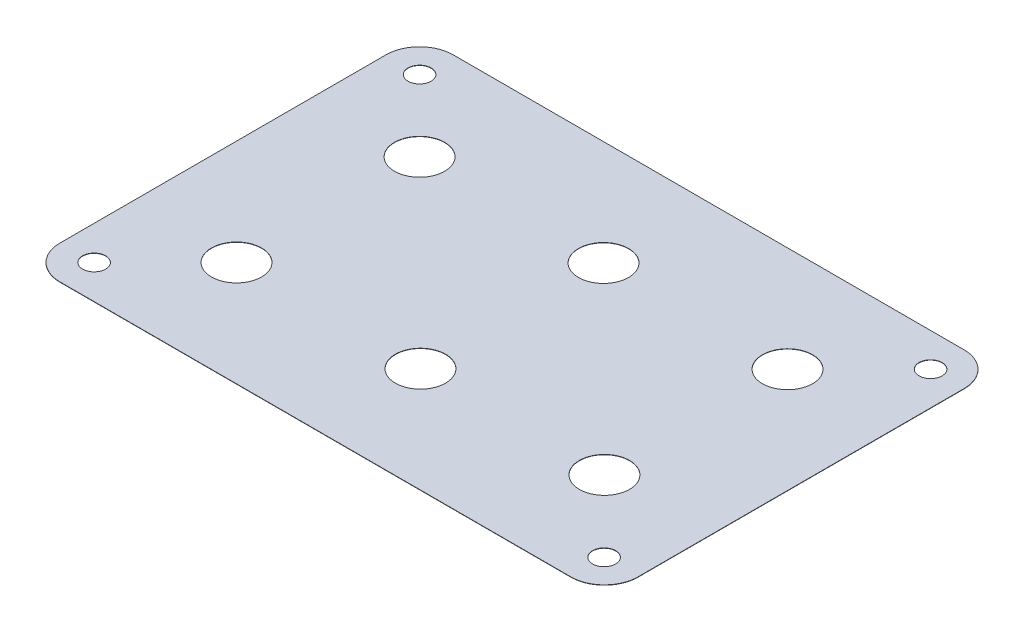
ISO-10303-21;
HEADER;
FILE_DESCRIPTION(('STEP AP214'),'2;1');
FILE_NAME('part.step','',(''),(''),'','','');
FILE_SCHEMA(('AUTOMOTIVE_DESIGN { 1 0 10303 214 1 1 1 1 }'));
ENDSEC;
DATA;
#1=APPLICATION_CONTEXT('core data for automotive mechanical design processes');
#2=APPLICATION_PROTOCOL_DEFINITION('international standard','automotive_design',2000,#1);
#3=PRODUCT_CONTEXT('',#1,'mechanical');
#4=PRODUCT('Part','Part','',(#3));
#5=PRODUCT_RELATED_PRODUCT_CATEGORY('part','',(#4));
#6=PRODUCT_DEFINITION_FORMATION('','',#4);
#7=PRODUCT_DEFINITION_CONTEXT('part definition',#1,'design');
#8=PRODUCT_DEFINITION('design','',#6,#7);
#9=PRODUCT_DEFINITION_SHAPE('','',#8);
#10=(LENGTH_UNIT() NAMED_UNIT(*) SI_UNIT(.MILLI.,.METRE.));
#11=(NAMED_UNIT(*) PLANE_ANGLE_UNIT() SI_UNIT($,.RADIAN.));
#12=(NAMED_UNIT(*) SI_UNIT($,.STERADIAN.) SOLID_ANGLE_UNIT());
#13=UNCERTAINTY_MEASURE_WITH_UNIT(LENGTH_MEASURE(1.E-05),#10,'distance_accuracy_value','');
#14=(GEOMETRIC_REPRESENTATION_CONTEXT(3) GLOBAL_UNCERTAINTY_ASSIGNED_CONTEXT((#13)) GLOBAL_UNIT_ASSIGNED_CONTEXT((#10,
#11,#12)) REPRESENTATION_CONTEXT('',''));
#15=CARTESIAN_POINT('',(0.,0.,0.));
#16=DIRECTION('',(0.,0.,1.));
#17=DIRECTION('',(1.,0.,0.));
#18=AXIS2_PLACEMENT_3D('',#15,#16,#17);
#19=CARTESIAN_POINT('',(7991.475,3.175,-9992.74082946777));
#20=DIRECTION('',(0.,1.,0.));
#21=DIRECTION('',(0.,0.,1.));
#22=AXIS2_PLACEMENT_3D('',#19,#20,#21);
#23=PLANE('',#22);
#24=CARTESIAN_POINT('',(7736.07818603515,3.175,-10244.5816589355));
#25=DIRECTION('',(0.,1.,0.));
#26=DIRECTION('',(0.,0.,1.));
#27=AXIS2_PLACEMENT_3D('',#24,#25,#26);
#28=CIRCLE('',#27,122.428186035156);
#29=CARTESIAN_POINT('',(7736.07818603515,3.175,-10122.1534729004));
#30=VERTEX_POINT('',#29);
#31=EDGE_CURVE('E241',#30,#30,#28,.T.);
#32=ORIENTED_EDGE('',*,*,#31,.F.);
#33=EDGE_LOOP('',(#32));
#34=FACE_BOUND('',#33,.T.);
#35=CARTESIAN_POINT('',(2316.98803100586,3.175,-13704.3159263611));
#36=DIRECTION('',(0.,1.,0.));
#37=DIRECTION('',(0.,0.,1.));
#38=AXIS2_PLACEMENT_3D('',#35,#36,#37);
#39=CIRCLE('',#38,122.427943801899);
#40=CARTESIAN_POINT('',(2316.98803100586,3.175,-13581.8879825592));
#41=VERTEX_POINT('',#40);
#42=EDGE_CURVE('E253',#41,#41,#39,.T.);
#43=ORIENTED_EDGE('',*,*,#42,.F.);
#44=EDGE_LOOP('',(#43));
#45=FACE_BOUND('',#44,.T.);
#46=CARTESIAN_POINT('',(5026.40598449707,3.175,-11004.2957519531));
#47=DIRECTION('',(0.,1.,0.));
#48=DIRECTION('',(0.,0.,1.));
#49=AXIS2_PLACEMENT_3D('',#46,#47,#48);
#50=CIRCLE('',#49,266.445945739755);
#51=CARTESIAN_POINT('',(5026.40598449707,3.175,-10737.8498062134));
#52=VERTEX_POINT('',#51);
#53=EDGE_CURVE('E265',#52,#52,#50,.T.);
#54=ORIENTED_EDGE('',*,*,#53,.F.);
#55=EDGE_LOOP('',(#54));
#56=FACE_BOUND('',#55,.T.);
#57=CARTESIAN_POINT('',(6980.17393798828,3.175,-12948.1577209473));
#58=DIRECTION('',(0.,1.,0.));
#59=DIRECTION('',(0.,0.,1.));
#60=AXIS2_PLACEMENT_3D('',#57,#58,#59);
#61=CIRCLE('',#60,266.445751953125);
#62=CARTESIAN_POINT('',(6980.17393798828,3.175,-12681.7119689941));
#63=VERTEX_POINT('',#62);
#64=EDGE_CURVE('E277',#63,#63,#61,.T.);
#65=ORIENTED_EDGE('',*,*,#64,.F.);
#66=EDGE_LOOP('',(#65));
#67=FACE_BOUND('',#66,.T.);
#68=CARTESIAN_POINT('',(3072.89208526611,3.175,-12948.1577209473));
#69=DIRECTION('',(0.,1.,0.));
#70=DIRECTION('',(0.,0.,1.));
#71=AXIS2_PLACEMENT_3D('',#68,#69,#70);
#72=CIRCLE('',#71,266.445848846435);
#73=CARTESIAN_POINT('',(3072.89208526611,3.175,-12681.7118721008));
#74=VERTEX_POINT('',#73);
#75=EDGE_CURVE('E289',#74,#74,#72,.T.);
#76=ORIENTED_EDGE('',*,*,#75,.F.);
#77=EDGE_LOOP('',(#76));
#78=FACE_BOUND('',#77,.T.);
#79=CARTESIAN_POINT('',(7739.12606201172,3.175,-9888.21968994141));
#80=CARTESIAN_POINT('',(7936.23031005859,3.175,-9888.21968994141));
#81=CARTESIAN_POINT('',(8095.99575195312,3.175,-10047.9859069824));
#82=CARTESIAN_POINT('',(8095.99575195312,3.175,-10245.0901550293));
#83=B_SPLINE_CURVE_WITH_KNOTS('',3,(#79,#80,#81,#82),.UNSPECIFIED.,.F.,.F.,(4,4),(7.,8.),.UNSPECIFIED.);
#84=CARTESIAN_POINT('',(7739.12606201172,3.175,-9888.21968994141));
#85=VERTEX_POINT('',#84);
#86=CARTESIAN_POINT('',(8095.99575195312,3.175,-10245.0901550293));
#87=VERTEX_POINT('',#86);
#88=EDGE_CURVE('E294',#85,#87,#83,.T.);
#89=ORIENTED_EDGE('',*,*,#88,.T.);
#90=DIRECTION('',(0.,0.,-1.));
#91=VECTOR('',#90,1.);
#92=CARTESIAN_POINT('',(8095.99575195312,3.175,-13707.3640930176));
#93=LINE('',#92,#91);
#94=CARTESIAN_POINT('',(8095.99575195312,3.175,-13707.3640930176));
#95=VERTEX_POINT('',#94);
#96=EDGE_CURVE('E94',#87,#95,#93,.T.);
#97=ORIENTED_EDGE('',*,*,#96,.T.);
#98=CARTESIAN_POINT('',(8095.99575195312,3.175,-13707.3640930176));
#99=CARTESIAN_POINT('',(8095.99575195312,3.175,-13904.4683410644));
#100=CARTESIAN_POINT('',(7936.23031005859,3.175,-14064.2341705322));
#101=CARTESIAN_POINT('',(7739.12606201172,3.175,-14064.2341705322));
#102=B_SPLINE_CURVE_WITH_KNOTS('',3,(#98,#99,#100,#101),.UNSPECIFIED.,.F.,.F.,(4,4),(5.,6.),.UNSPECIFIED.);
#103=CARTESIAN_POINT('',(7739.12606201172,3.175,-14064.2341705322));
#104=VERTEX_POINT('',#103);
#105=EDGE_CURVE('E160',#95,#104,#102,.T.);
#106=ORIENTED_EDGE('',*,*,#105,.T.);
#107=DIRECTION('',(-1.,0.,0.));
#108=VECTOR('',#107,1.);
#109=CARTESIAN_POINT('',(2313.68590698242,3.175,-14064.2341705322));
#110=LINE('',#109,#108);
#111=CARTESIAN_POINT('',(2313.68590698242,3.175,-14064.2341705322));
#112=VERTEX_POINT('',#111);
#113=EDGE_CURVE('E155',#104,#112,#110,.T.);
#114=ORIENTED_EDGE('',*,*,#113,.T.);
#115=CARTESIAN_POINT('',(2313.68590698242,3.175,-14064.2341705322));
#116=CARTESIAN_POINT('',(2116.58185272217,3.175,-14064.2341705322));
#117=CARTESIAN_POINT('',(1956.81582946777,3.175,-13904.4679534912));
#118=CARTESIAN_POINT('',(1956.81582946777,3.175,-13707.3640930176));
#119=B_SPLINE_CURVE_WITH_KNOTS('',3,(#115,#116,#117,#118),.UNSPECIFIED.,.F.,.F.,(4,4),(3.,4.),.UNSPECIFIED.);
#120=CARTESIAN_POINT('',(1956.81582946777,3.175,-13707.3640930176));
#121=VERTEX_POINT('',#120);
#122=EDGE_CURVE('E113',#112,#121,#119,.T.);
#123=ORIENTED_EDGE('',*,*,#122,.T.);
#124=DIRECTION('',(0.,0.,1.));
#125=VECTOR('',#124,1.);
#126=CARTESIAN_POINT('',(1956.81582946777,3.175,-10245.0893798828));
#127=LINE('',#126,#125);
#128=CARTESIAN_POINT('',(1956.81582946777,3.175,-10245.0893798828));
#129=VERTEX_POINT('',#128);
#130=EDGE_CURVE('E107',#121,#129,#127,.T.);
#131=ORIENTED_EDGE('',*,*,#130,.T.);
#132=CARTESIAN_POINT('',(1956.81582946777,3.175,-10245.0893798828));
#133=CARTESIAN_POINT('',(1956.81582946777,3.175,-10047.9859069824));
#134=CARTESIAN_POINT('',(2116.58185272217,3.175,-9888.21968994141));
#135=CARTESIAN_POINT('',(2313.68590698242,3.175,-9888.21968994141));
#136=B_SPLINE_CURVE_WITH_KNOTS('',3,(#132,#133,#134,#135),.UNSPECIFIED.,.F.,.F.,(4,4),(1.,2.),.UNSPECIFIED.);
#137=CARTESIAN_POINT('',(2313.68590698242,3.175,-9888.21968994141));
#138=VERTEX_POINT('',#137);
#139=EDGE_CURVE('E111',#129,#138,#136,.T.);
#140=ORIENTED_EDGE('',*,*,#139,.T.);
#141=DIRECTION('',(1.,0.,0.));
#142=VECTOR('',#141,1.);
#143=CARTESIAN_POINT('',(7739.12606201172,3.175,-9888.21968994141));
#144=LINE('',#143,#142);
#145=EDGE_CURVE('E51',#138,#85,#144,.T.);
#146=ORIENTED_EDGE('',*,*,#145,.T.);
#147=EDGE_LOOP('',(#89,#97,#106,#114,#123,#131,#140,#146));
#148=FACE_BOUND('',#147,.T.);
#149=CARTESIAN_POINT('',(5026.40598449707,3.175,-12948.1577209473));
#150=DIRECTION('',(0.,1.,0.));
#151=DIRECTION('',(0.,0.,1.));
#152=AXIS2_PLACEMENT_3D('',#149,#150,#151);
#153=CIRCLE('',#152,266.445945739755);
#154=CARTESIAN_POINT('',(5026.40598449707,3.175,-12681.7117752075));
#155=VERTEX_POINT('',#154);
#156=EDGE_CURVE('E283',#155,#155,#153,.T.);
#157=ORIENTED_EDGE('',*,*,#156,.F.);
#158=EDGE_LOOP('',(#157));
#159=FACE_BOUND('',#158,.T.);
#160=CARTESIAN_POINT('',(3072.89208526611,3.175,-11004.2957519531));
#161=DIRECTION('',(0.,1.,0.));
#162=DIRECTION('',(0.,0.,1.));
#163=AXIS2_PLACEMENT_3D('',#160,#161,#162);
#164=CIRCLE('',#163,266.445848846435);
#165=CARTESIAN_POINT('',(3072.89208526611,3.175,-10737.8499031067));
#166=VERTEX_POINT('',#165);
#167=EDGE_CURVE('E271',#166,#166,#164,.T.);
#168=ORIENTED_EDGE('',*,*,#167,.F.);
#169=EDGE_LOOP('',(#168));
#170=FACE_BOUND('',#169,.T.);
#171=CARTESIAN_POINT('',(6980.17393798828,3.175,-11004.2957519531));
#172=DIRECTION('',(0.,1.,0.));
#173=DIRECTION('',(0.,0.,1.));
#174=AXIS2_PLACEMENT_3D('',#171,#172,#173);
#175=CIRCLE('',#174,266.445751953125);
#176=CARTESIAN_POINT('',(6980.17393798828,3.175,-10737.85));
#177=VERTEX_POINT('',#176);
#178=EDGE_CURVE('E259',#177,#177,#175,.T.);
#179=ORIENTED_EDGE('',*,*,#178,.F.);
#180=EDGE_LOOP('',(#179));
#181=FACE_BOUND('',#180,.T.);
#182=CARTESIAN_POINT('',(2316.98803100586,3.175,-10248.3922790527));
#183=DIRECTION('',(0.,1.,0.));
#184=DIRECTION('',(0.,0.,1.));
#185=AXIS2_PLACEMENT_3D('',#182,#183,#184);
#186=CIRCLE('',#185,122.428089141846);
#187=CARTESIAN_POINT('',(2316.98803100586,3.175,-10125.9641899109));
#188=VERTEX_POINT('',#187);
#189=EDGE_CURVE('E247',#188,#188,#186,.T.);
#190=ORIENTED_EDGE('',*,*,#189,.F.);
#191=EDGE_LOOP('',(#190));
#192=FACE_BOUND('',#191,.T.);
#193=CARTESIAN_POINT('',(7739.63378295898,3.175,-13707.8718139648));
#194=DIRECTION('',(0.,1.,0.));
#195=DIRECTION('',(0.,0.,1.));
#196=AXIS2_PLACEMENT_3D('',#193,#194,#195);
#197=CIRCLE('',#196,122.428186035156);
#198=CARTESIAN_POINT('',(7739.63378295898,3.175,-13585.4436279297));
#199=VERTEX_POINT('',#198);
#200=EDGE_CURVE('E232',#199,#199,#197,.T.);
#201=ORIENTED_EDGE('',*,*,#200,.F.);
#202=EDGE_LOOP('',(#201));
#203=FACE_BOUND('',#202,.T.);
#204=ADVANCED_FACE('F33',(#34,#45,#56,#67,#78,#148,#159,#170,#181,#192,#203),#23,.T.);
#205=CARTESIAN_POINT('',(7991.475,0.,-9992.74082946777));
#206=DIRECTION('',(0.,1.,0.));
#207=DIRECTION('',(0.,0.,1.));
#208=AXIS2_PLACEMENT_3D('',#205,#206,#207);
#209=PLANE('',#208);
#210=CARTESIAN_POINT('',(7739.12606201172,0.,-9888.21968994141));
#211=CARTESIAN_POINT('',(7936.23031005859,0.,-9888.21968994141));
#212=CARTESIAN_POINT('',(8095.99575195312,0.,-10047.9859069824));
#213=CARTESIAN_POINT('',(8095.99575195312,0.,-10245.0901550293));
#214=B_SPLINE_CURVE_WITH_KNOTS('',3,(#210,#211,#212,#213),.UNSPECIFIED.,.F.,.F.,(4,4),(7.,8.),.UNSPECIFIED.);
#215=CARTESIAN_POINT('',(7739.12606201172,0.,-9888.21968994141));
#216=VERTEX_POINT('',#215);
#217=CARTESIAN_POINT('',(8095.99575195312,0.,-10245.0901550293));
#218=VERTEX_POINT('',#217);
#219=EDGE_CURVE('E292',#216,#218,#214,.T.);
#220=ORIENTED_EDGE('',*,*,#219,.F.);
#221=DIRECTION('',(1.,0.,0.));
#222=VECTOR('',#221,1.);
#223=CARTESIAN_POINT('',(7739.12606201172,0.,-9888.21968994141));
#224=LINE('',#223,#222);
#225=CARTESIAN_POINT('',(2313.68590698242,0.,-9888.21968994141));
#226=VERTEX_POINT('',#225);
#227=EDGE_CURVE('E86',#226,#216,#224,.T.);
#228=ORIENTED_EDGE('',*,*,#227,.F.);
#229=CARTESIAN_POINT('',(1956.81582946777,0.,-10245.0893798828));
#230=CARTESIAN_POINT('',(1956.81582946777,0.,-10047.9859069824));
#231=CARTESIAN_POINT('',(2116.58185272217,0.,-9888.21968994141));
#232=CARTESIAN_POINT('',(2313.68590698242,0.,-9888.21968994141));
#233=B_SPLINE_CURVE_WITH_KNOTS('',3,(#229,#230,#231,#232),.UNSPECIFIED.,.F.,.F.,(4,4),(1.,2.),.UNSPECIFIED.);
#234=CARTESIAN_POINT('',(1956.81582946777,0.,-10245.0893798828));
#235=VERTEX_POINT('',#234);
#236=EDGE_CURVE('E80',#235,#226,#233,.T.);
#237=ORIENTED_EDGE('',*,*,#236,.F.);
#238=DIRECTION('',(0.,0.,1.));
#239=VECTOR('',#238,1.);
#240=CARTESIAN_POINT('',(1956.81582946777,0.,-10245.0893798828));
#241=LINE('',#240,#239);
#242=CARTESIAN_POINT('',(1956.81582946777,0.,-13707.3640930176));
#243=VERTEX_POINT('',#242);
#244=EDGE_CURVE('E121',#243,#235,#241,.T.);
#245=ORIENTED_EDGE('',*,*,#244,.F.);
#246=CARTESIAN_POINT('',(2313.68590698242,0.,-14064.2341705322));
#247=CARTESIAN_POINT('',(2116.58185272217,0.,-14064.2341705322));
#248=CARTESIAN_POINT('',(1956.81582946777,0.,-13904.4679534912));
#249=CARTESIAN_POINT('',(1956.81582946777,0.,-13707.3640930176));
#250=B_SPLINE_CURVE_WITH_KNOTS('',3,(#246,#247,#248,#249),.UNSPECIFIED.,.F.,.F.,(4,4),(3.,4.),.UNSPECIFIED.);
#251=CARTESIAN_POINT('',(2313.68590698242,0.,-14064.2341705322));
#252=VERTEX_POINT('',#251);
#253=EDGE_CURVE('E329',#252,#243,#250,.T.);
#254=ORIENTED_EDGE('',*,*,#253,.F.);
#255=DIRECTION('',(-1.,0.,0.));
#256=VECTOR('',#255,1.);
#257=CARTESIAN_POINT('',(2313.68590698242,0.,-14064.2341705322));
#258=LINE('',#257,#256);
#259=CARTESIAN_POINT('',(7739.12606201172,0.,-14064.2341705322));
#260=VERTEX_POINT('',#259);
#261=EDGE_CURVE('E327',#260,#252,#258,.T.);
#262=ORIENTED_EDGE('',*,*,#261,.F.);
#263=CARTESIAN_POINT('',(8095.99575195312,0.,-13707.3640930176));
#264=CARTESIAN_POINT('',(8095.99575195312,0.,-13904.4683410644));
#265=CARTESIAN_POINT('',(7936.23031005859,0.,-14064.2341705322));
#266=CARTESIAN_POINT('',(7739.12606201172,0.,-14064.2341705322));
#267=B_SPLINE_CURVE_WITH_KNOTS('',3,(#263,#264,#265,#266),.UNSPECIFIED.,.F.,.F.,(4,4),(5.,6.),.UNSPECIFIED.);
#268=CARTESIAN_POINT('',(8095.99575195312,0.,-13707.3640930176));
#269=VERTEX_POINT('',#268);
#270=EDGE_CURVE('E321',#269,#260,#267,.T.);
#271=ORIENTED_EDGE('',*,*,#270,.F.);
#272=DIRECTION('',(0.,0.,-1.));
#273=VECTOR('',#272,1.);
#274=CARTESIAN_POINT('',(8095.99575195312,0.,-13707.3640930176));
#275=LINE('',#274,#273);
#276=EDGE_CURVE('E325',#218,#269,#275,.T.);
#277=ORIENTED_EDGE('',*,*,#276,.F.);
#278=EDGE_LOOP('',(#220,#228,#237,#245,#254,#262,#271,#277));
#279=FACE_BOUND('',#278,.T.);
#280=CARTESIAN_POINT('',(3072.89208526611,0.,-12948.1577209473));
#281=DIRECTION('',(0.,1.,0.));
#282=DIRECTION('',(0.,0.,1.));
#283=AXIS2_PLACEMENT_3D('',#280,#281,#282);
#284=CIRCLE('',#283,266.445848846435);
#285=CARTESIAN_POINT('',(3072.89208526611,0.,-12681.7118721008));
#286=VERTEX_POINT('',#285);
#287=EDGE_CURVE('E286',#286,#286,#284,.T.);
#288=ORIENTED_EDGE('',*,*,#287,.T.);
#289=EDGE_LOOP('',(#288));
#290=FACE_BOUND('',#289,.T.);
#291=CARTESIAN_POINT('',(5026.40598449707,0.,-12948.1577209473));
#292=DIRECTION('',(0.,1.,0.));
#293=DIRECTION('',(0.,0.,1.));
#294=AXIS2_PLACEMENT_3D('',#291,#292,#293);
#295=CIRCLE('',#294,266.445945739755);
#296=CARTESIAN_POINT('',(5026.40598449707,0.,-12681.7117752075));
#297=VERTEX_POINT('',#296);
#298=EDGE_CURVE('E280',#297,#297,#295,.T.);
#299=ORIENTED_EDGE('',*,*,#298,.T.);
#300=EDGE_LOOP('',(#299));
#301=FACE_BOUND('',#300,.T.);
#302=CARTESIAN_POINT('',(6980.17393798828,0.,-12948.1577209473));
#303=DIRECTION('',(0.,1.,0.));
#304=DIRECTION('',(0.,0.,1.));
#305=AXIS2_PLACEMENT_3D('',#302,#303,#304);
#306=CIRCLE('',#305,266.445751953125);
#307=CARTESIAN_POINT('',(6980.17393798828,0.,-12681.7119689941));
#308=VERTEX_POINT('',#307);
#309=EDGE_CURVE('E274',#308,#308,#306,.T.);
#310=ORIENTED_EDGE('',*,*,#309,.T.);
#311=EDGE_LOOP('',(#310));
#312=FACE_BOUND('',#311,.T.);
#313=CARTESIAN_POINT('',(3072.89208526611,0.,-11004.2957519531));
#314=DIRECTION('',(0.,1.,0.));
#315=DIRECTION('',(0.,0.,1.));
#316=AXIS2_PLACEMENT_3D('',#313,#314,#315);
#317=CIRCLE('',#316,266.445848846435);
#318=CARTESIAN_POINT('',(3072.89208526611,0.,-10737.8499031067));
#319=VERTEX_POINT('',#318);
#320=EDGE_CURVE('E268',#319,#319,#317,.T.);
#321=ORIENTED_EDGE('',*,*,#320,.T.);
#322=EDGE_LOOP('',(#321));
#323=FACE_BOUND('',#322,.T.);
#324=CARTESIAN_POINT('',(5026.40598449707,0.,-11004.2957519531));
#325=DIRECTION('',(0.,1.,0.));
#326=DIRECTION('',(0.,0.,1.));
#327=AXIS2_PLACEMENT_3D('',#324,#325,#326);
#328=CIRCLE('',#327,266.445945739755);
#329=CARTESIAN_POINT('',(5026.40598449707,0.,-10737.8498062134));
#330=VERTEX_POINT('',#329);
#331=EDGE_CURVE('E262',#330,#330,#328,.T.);
#332=ORIENTED_EDGE('',*,*,#331,.T.);
#333=EDGE_LOOP('',(#332));
#334=FACE_BOUND('',#333,.T.);
#335=CARTESIAN_POINT('',(6980.17393798828,0.,-11004.2957519531));
#336=DIRECTION('',(0.,1.,0.));
#337=DIRECTION('',(0.,0.,1.));
#338=AXIS2_PLACEMENT_3D('',#335,#336,#337);
#339=CIRCLE('',#338,266.445751953125);
#340=CARTESIAN_POINT('',(6980.17393798828,0.,-10737.85));
#341=VERTEX_POINT('',#340);
#342=EDGE_CURVE('E256',#341,#341,#339,.T.);
#343=ORIENTED_EDGE('',*,*,#342,.T.);
#344=EDGE_LOOP('',(#343));
#345=FACE_BOUND('',#344,.T.);
#346=CARTESIAN_POINT('',(2316.98803100586,0.,-13704.3159263611));
#347=DIRECTION('',(0.,1.,0.));
#348=DIRECTION('',(0.,0.,1.));
#349=AXIS2_PLACEMENT_3D('',#346,#347,#348);
#350=CIRCLE('',#349,122.427943801899);
#351=CARTESIAN_POINT('',(2316.98803100586,0.,-13581.8879825592));
#352=VERTEX_POINT('',#351);
#353=EDGE_CURVE('E250',#352,#352,#350,.T.);
#354=ORIENTED_EDGE('',*,*,#353,.T.);
#355=EDGE_LOOP('',(#354));
#356=FACE_BOUND('',#355,.T.);
#357=CARTESIAN_POINT('',(2316.98803100586,0.,-10248.3922790527));
#358=DIRECTION('',(0.,1.,0.));
#359=DIRECTION('',(0.,0.,1.));
#360=AXIS2_PLACEMENT_3D('',#357,#358,#359);
#361=CIRCLE('',#360,122.428089141846);
#362=CARTESIAN_POINT('',(2316.98803100586,0.,-10125.9641899109));
#363=VERTEX_POINT('',#362);
#364=EDGE_CURVE('E244',#363,#363,#361,.T.);
#365=ORIENTED_EDGE('',*,*,#364,.T.);
#366=EDGE_LOOP('',(#365));
#367=FACE_BOUND('',#366,.T.);
#368=CARTESIAN_POINT('',(7736.07818603515,0.,-10244.5816589355));
#369=DIRECTION('',(0.,1.,0.));
#370=DIRECTION('',(0.,0.,1.));
#371=AXIS2_PLACEMENT_3D('',#368,#369,#370);
#372=CIRCLE('',#371,122.428186035156);
#373=CARTESIAN_POINT('',(7736.07818603515,0.,-10122.1534729004));
#374=VERTEX_POINT('',#373);
#375=EDGE_CURVE('E238',#374,#374,#372,.T.);
#376=ORIENTED_EDGE('',*,*,#375,.T.);
#377=EDGE_LOOP('',(#376));
#378=FACE_BOUND('',#377,.T.);
#379=CARTESIAN_POINT('',(7739.63378295898,0.,-13707.8718139648));
#380=DIRECTION('',(0.,1.,0.));
#381=DIRECTION('',(0.,0.,1.));
#382=AXIS2_PLACEMENT_3D('',#379,#380,#381);
#383=CIRCLE('',#382,122.428186035156);
#384=CARTESIAN_POINT('',(7739.63378295898,0.,-13585.4436279297));
#385=VERTEX_POINT('',#384);
#386=EDGE_CURVE('E235',#385,#385,#383,.T.);
#387=ORIENTED_EDGE('',*,*,#386,.T.);
#388=EDGE_LOOP('',(#387));
#389=FACE_BOUND('',#388,.T.);
#390=ADVANCED_FACE('F176',(#279,#290,#301,#312,#323,#334,#345,#356,#367,#378,#389),#209,.F.);
#391=DIRECTION('',(0.,-1.,0.));
#392=VECTOR('',#391,1.);
#393=SURFACE_OF_LINEAR_EXTRUSION('',#83,#392);
#394=ORIENTED_EDGE('',*,*,#219,.T.);
#395=DIRECTION('',(0.,-1.,0.));
#396=VECTOR('',#395,1.);
#397=CARTESIAN_POINT('',(8095.99575195312,3.175,-10245.0901550293));
#398=LINE('',#397,#396);
#399=EDGE_CURVE('E11',#87,#218,#398,.T.);
#400=ORIENTED_EDGE('',*,*,#399,.F.);
#401=ORIENTED_EDGE('',*,*,#88,.F.);
#402=DIRECTION('',(0.,-1.,0.));
#403=VECTOR('',#402,1.);
#404=CARTESIAN_POINT('',(7739.12606201172,3.175,-9888.21968994141));
#405=LINE('',#404,#403);
#406=EDGE_CURVE('E127',#85,#216,#405,.T.);
#407=ORIENTED_EDGE('',*,*,#406,.T.);
#408=EDGE_LOOP('',(#394,#400,#401,#407));
#409=FACE_BOUND('',#408,.T.);
#410=ADVANCED_FACE('F35',(#409),#393,.F.);
#411=CARTESIAN_POINT('',(8095.99575195312,3.175,-13707.3640930176));
#412=DIRECTION('',(-1.,0.,0.));
#413=DIRECTION('',(0.,0.,1.));
#414=AXIS2_PLACEMENT_3D('',#411,#412,#413);
#415=PLANE('',#414);
#416=ORIENTED_EDGE('',*,*,#276,.T.);
#417=DIRECTION('',(0.,-1.,0.));
#418=VECTOR('',#417,1.);
#419=CARTESIAN_POINT('',(8095.99575195312,3.175,-13707.3640930176));
#420=LINE('',#419,#418);
#421=EDGE_CURVE('E43',#95,#269,#420,.T.);
#422=ORIENTED_EDGE('',*,*,#421,.F.);
#423=ORIENTED_EDGE('',*,*,#96,.F.);
#424=ORIENTED_EDGE('',*,*,#399,.T.);
#425=EDGE_LOOP('',(#416,#422,#423,#424));
#426=FACE_BOUND('',#425,.T.);
#427=ADVANCED_FACE('F170',(#426),#415,.F.);
#428=DIRECTION('',(0.,-1.,0.));
#429=VECTOR('',#428,1.);
#430=SURFACE_OF_LINEAR_EXTRUSION('',#102,#429);
#431=ORIENTED_EDGE('',*,*,#270,.T.);
#432=DIRECTION('',(0.,-1.,0.));
#433=VECTOR('',#432,1.);
#434=CARTESIAN_POINT('',(7739.12606201172,3.175,-14064.2341705322));
#435=LINE('',#434,#433);
#436=EDGE_CURVE('E315',#104,#260,#435,.T.);
#437=ORIENTED_EDGE('',*,*,#436,.F.);
#438=ORIENTED_EDGE('',*,*,#105,.F.);
#439=ORIENTED_EDGE('',*,*,#421,.T.);
#440=EDGE_LOOP('',(#431,#437,#438,#439));
#441=FACE_BOUND('',#440,.T.);
#442=ADVANCED_FACE('F168',(#441),#430,.F.);
#443=CARTESIAN_POINT('',(2313.68590698242,3.175,-14064.2341705322));
#444=DIRECTION('',(0.,0.,1.));
#445=DIRECTION('',(1.,0.,0.));
#446=AXIS2_PLACEMENT_3D('',#443,#444,#445);
#447=PLANE('',#446);
#448=ORIENTED_EDGE('',*,*,#261,.T.);
#449=DIRECTION('',(0.,-1.,0.));
#450=VECTOR('',#449,1.);
#451=CARTESIAN_POINT('',(2313.68590698242,3.175,-14064.2341705322));
#452=LINE('',#451,#450);
#453=EDGE_CURVE('E312',#112,#252,#452,.T.);
#454=ORIENTED_EDGE('',*,*,#453,.F.);
#455=ORIENTED_EDGE('',*,*,#113,.F.);
#456=ORIENTED_EDGE('',*,*,#436,.T.);
#457=EDGE_LOOP('',(#448,#454,#455,#456));
#458=FACE_BOUND('',#457,.T.);
#459=ADVANCED_FACE('F148',(#458),#447,.F.);
#460=DIRECTION('',(0.,-1.,0.));
#461=VECTOR('',#460,1.);
#462=SURFACE_OF_LINEAR_EXTRUSION('',#119,#461);
#463=ORIENTED_EDGE('',*,*,#253,.T.);
#464=DIRECTION('',(0.,-1.,0.));
#465=VECTOR('',#464,1.);
#466=CARTESIAN_POINT('',(1956.81582946777,3.175,-13707.3640930176));
#467=LINE('',#466,#465);
#468=EDGE_CURVE('E122',#121,#243,#467,.T.);
#469=ORIENTED_EDGE('',*,*,#468,.F.);
#470=ORIENTED_EDGE('',*,*,#122,.F.);
#471=ORIENTED_EDGE('',*,*,#453,.T.);
#472=EDGE_LOOP('',(#463,#469,#470,#471));
#473=FACE_BOUND('',#472,.T.);
#474=ADVANCED_FACE('F145',(#473),#462,.F.);
#475=CARTESIAN_POINT('',(1956.81582946777,3.175,-10245.0893798828));
#476=DIRECTION('',(1.,0.,0.));
#477=DIRECTION('',(0.,0.,-1.));
#478=AXIS2_PLACEMENT_3D('',#475,#476,#477);
#479=PLANE('',#478);
#480=ORIENTED_EDGE('',*,*,#244,.T.);
#481=DIRECTION('',(0.,-1.,0.));
#482=VECTOR('',#481,1.);
#483=CARTESIAN_POINT('',(1956.81582946777,3.175,-10245.0893798828));
#484=LINE('',#483,#482);
#485=EDGE_CURVE('E118',#129,#235,#484,.T.);
#486=ORIENTED_EDGE('',*,*,#485,.F.);
#487=ORIENTED_EDGE('',*,*,#130,.F.);
#488=ORIENTED_EDGE('',*,*,#468,.T.);
#489=EDGE_LOOP('',(#480,#486,#487,#488));
#490=FACE_BOUND('',#489,.T.);
#491=ADVANCED_FACE('F119',(#490),#479,.F.);
#492=DIRECTION('',(0.,-1.,0.));
#493=VECTOR('',#492,1.);
#494=SURFACE_OF_LINEAR_EXTRUSION('',#136,#493);
#495=ORIENTED_EDGE('',*,*,#236,.T.);
#496=DIRECTION('',(0.,-1.,0.));
#497=VECTOR('',#496,1.);
#498=CARTESIAN_POINT('',(2313.68590698242,3.175,-9888.21968994141));
#499=LINE('',#498,#497);
#500=EDGE_CURVE('E123',#138,#226,#499,.T.);
#501=ORIENTED_EDGE('',*,*,#500,.F.);
#502=ORIENTED_EDGE('',*,*,#139,.F.);
#503=ORIENTED_EDGE('',*,*,#485,.T.);
#504=EDGE_LOOP('',(#495,#501,#502,#503));
#505=FACE_BOUND('',#504,.T.);
#506=ADVANCED_FACE('F125',(#505),#494,.F.);
#507=CARTESIAN_POINT('',(7739.12606201172,3.175,-9888.21968994141));
#508=DIRECTION('',(0.,0.,-1.));
#509=DIRECTION('',(-1.,0.,0.));
#510=AXIS2_PLACEMENT_3D('',#507,#508,#509);
#511=PLANE('',#510);
#512=ORIENTED_EDGE('',*,*,#227,.T.);
#513=ORIENTED_EDGE('',*,*,#406,.F.);
#514=ORIENTED_EDGE('',*,*,#145,.F.);
#515=ORIENTED_EDGE('',*,*,#500,.T.);
#516=EDGE_LOOP('',(#512,#513,#514,#515));
#517=FACE_BOUND('',#516,.T.);
#518=ADVANCED_FACE('F141',(#517),#511,.F.);
#519=CARTESIAN_POINT('',(3072.89208526611,3.175,-12948.1577209473));
#520=DIRECTION('',(0.,-1.,0.));
#521=DIRECTION('',(0.,0.,-1.));
#522=AXIS2_PLACEMENT_3D('',#519,#520,#521);
#523=CYLINDRICAL_SURFACE('',#522,266.445848846435);
#524=ORIENTED_EDGE('',*,*,#75,.T.);
#525=EDGE_LOOP('',(#524));
#526=FACE_BOUND('',#525,.T.);
#527=ORIENTED_EDGE('',*,*,#287,.F.);
#528=EDGE_LOOP('',(#527));
#529=FACE_BOUND('',#528,.T.);
#530=ADVANCED_FACE('F188',(#526,#529),#523,.F.);
#531=CARTESIAN_POINT('',(5026.40598449707,3.175,-12948.1577209473));
#532=DIRECTION('',(0.,-1.,0.));
#533=DIRECTION('',(0.,0.,-1.));
#534=AXIS2_PLACEMENT_3D('',#531,#532,#533);
#535=CYLINDRICAL_SURFACE('',#534,266.445945739755);
#536=ORIENTED_EDGE('',*,*,#156,.T.);
#537=EDGE_LOOP('',(#536));
#538=FACE_BOUND('',#537,.T.);
#539=ORIENTED_EDGE('',*,*,#298,.F.);
#540=EDGE_LOOP('',(#539));
#541=FACE_BOUND('',#540,.T.);
#542=ADVANCED_FACE('F191',(#538,#541),#535,.F.);
#543=CARTESIAN_POINT('',(6980.17393798828,3.175,-12948.1577209473));
#544=DIRECTION('',(0.,-1.,0.));
#545=DIRECTION('',(0.,0.,-1.));
#546=AXIS2_PLACEMENT_3D('',#543,#544,#545);
#547=CYLINDRICAL_SURFACE('',#546,266.445751953125);
#548=ORIENTED_EDGE('',*,*,#64,.T.);
#549=EDGE_LOOP('',(#548));
#550=FACE_BOUND('',#549,.T.);
#551=ORIENTED_EDGE('',*,*,#309,.F.);
#552=EDGE_LOOP('',(#551));
#553=FACE_BOUND('',#552,.T.);
#554=ADVANCED_FACE('F195',(#550,#553),#547,.F.);
#555=CARTESIAN_POINT('',(3072.89208526611,3.175,-11004.2957519531));
#556=DIRECTION('',(0.,-1.,0.));
#557=DIRECTION('',(0.,0.,-1.));
#558=AXIS2_PLACEMENT_3D('',#555,#556,#557);
#559=CYLINDRICAL_SURFACE('',#558,266.445848846435);
#560=ORIENTED_EDGE('',*,*,#167,.T.);
#561=EDGE_LOOP('',(#560));
#562=FACE_BOUND('',#561,.T.);
#563=ORIENTED_EDGE('',*,*,#320,.F.);
#564=EDGE_LOOP('',(#563));
#565=FACE_BOUND('',#564,.T.);
#566=ADVANCED_FACE('F199',(#562,#565),#559,.F.);
#567=CARTESIAN_POINT('',(5026.40598449707,3.175,-11004.2957519531));
#568=DIRECTION('',(0.,-1.,0.));
#569=DIRECTION('',(0.,0.,-1.));
#570=AXIS2_PLACEMENT_3D('',#567,#568,#569);
#571=CYLINDRICAL_SURFACE('',#570,266.445945739755);
#572=ORIENTED_EDGE('',*,*,#53,.T.);
#573=EDGE_LOOP('',(#572));
#574=FACE_BOUND('',#573,.T.);
#575=ORIENTED_EDGE('',*,*,#331,.F.);
#576=EDGE_LOOP('',(#575));
#577=FACE_BOUND('',#576,.T.);
#578=ADVANCED_FACE('F203',(#574,#577),#571,.F.);
#579=CARTESIAN_POINT('',(6980.17393798828,3.175,-11004.2957519531));
#580=DIRECTION('',(0.,-1.,0.));
#581=DIRECTION('',(0.,0.,-1.));
#582=AXIS2_PLACEMENT_3D('',#579,#580,#581);
#583=CYLINDRICAL_SURFACE('',#582,266.445751953125);
#584=ORIENTED_EDGE('',*,*,#178,.T.);
#585=EDGE_LOOP('',(#584));
#586=FACE_BOUND('',#585,.T.);
#587=ORIENTED_EDGE('',*,*,#342,.F.);
#588=EDGE_LOOP('',(#587));
#589=FACE_BOUND('',#588,.T.);
#590=ADVANCED_FACE('F207',(#586,#589),#583,.F.);
#591=CARTESIAN_POINT('',(2316.98803100586,3.175,-13704.3159263611));
#592=DIRECTION('',(0.,-1.,0.));
#593=DIRECTION('',(0.,0.,-1.));
#594=AXIS2_PLACEMENT_3D('',#591,#592,#593);
#595=CYLINDRICAL_SURFACE('',#594,122.427943801899);
#596=ORIENTED_EDGE('',*,*,#42,.T.);
#597=EDGE_LOOP('',(#596));
#598=FACE_BOUND('',#597,.T.);
#599=ORIENTED_EDGE('',*,*,#353,.F.);
#600=EDGE_LOOP('',(#599));
#601=FACE_BOUND('',#600,.T.);
#602=ADVANCED_FACE('F211',(#598,#601),#595,.F.);
#603=CARTESIAN_POINT('',(2316.98803100586,3.175,-10248.3922790527));
#604=DIRECTION('',(0.,-1.,0.));
#605=DIRECTION('',(0.,0.,-1.));
#606=AXIS2_PLACEMENT_3D('',#603,#604,#605);
#607=CYLINDRICAL_SURFACE('',#606,122.428089141846);
#608=ORIENTED_EDGE('',*,*,#189,.T.);
#609=EDGE_LOOP('',(#608));
#610=FACE_BOUND('',#609,.T.);
#611=ORIENTED_EDGE('',*,*,#364,.F.);
#612=EDGE_LOOP('',(#611));
#613=FACE_BOUND('',#612,.T.);
#614=ADVANCED_FACE('F215',(#610,#613),#607,.F.);
#615=CARTESIAN_POINT('',(7736.07818603515,3.175,-10244.5816589355));
#616=DIRECTION('',(0.,-1.,0.));
#617=DIRECTION('',(0.,0.,-1.));
#618=AXIS2_PLACEMENT_3D('',#615,#616,#617);
#619=CYLINDRICAL_SURFACE('',#618,122.428186035156);
#620=ORIENTED_EDGE('',*,*,#31,.T.);
#621=EDGE_LOOP('',(#620));
#622=FACE_BOUND('',#621,.T.);
#623=ORIENTED_EDGE('',*,*,#375,.F.);
#624=EDGE_LOOP('',(#623));
#625=FACE_BOUND('',#624,.T.);
#626=ADVANCED_FACE('F219',(#622,#625),#619,.F.);
#627=CARTESIAN_POINT('',(7739.63378295898,3.175,-13707.8718139648));
#628=DIRECTION('',(0.,-1.,0.));
#629=DIRECTION('',(0.,0.,-1.));
#630=AXIS2_PLACEMENT_3D('',#627,#628,#629);
#631=CYLINDRICAL_SURFACE('',#630,122.428186035156);
#632=ORIENTED_EDGE('',*,*,#200,.T.);
#633=EDGE_LOOP('',(#632));
#634=FACE_BOUND('',#633,.T.);
#635=ORIENTED_EDGE('',*,*,#386,.F.);
#636=EDGE_LOOP('',(#635));
#637=FACE_BOUND('',#636,.T.);
#638=ADVANCED_FACE('F223',(#634,#637),#631,.F.);
#639=CLOSED_SHELL('',(#204,#390,#410,#427,#442,#459,#474,#491,#506,#518,#530,#542,#554,#566,
#578,#590,#602,#614,#626,#638));
#640=MANIFOLD_SOLID_BREP('B2',#639);
#641=ADVANCED_BREP_SHAPE_REPRESENTATION('',(#18,#640),#14);
#642=SHAPE_DEFINITION_REPRESENTATION(#9,#641);
ENDSEC;
END-ISO-10303-21;
